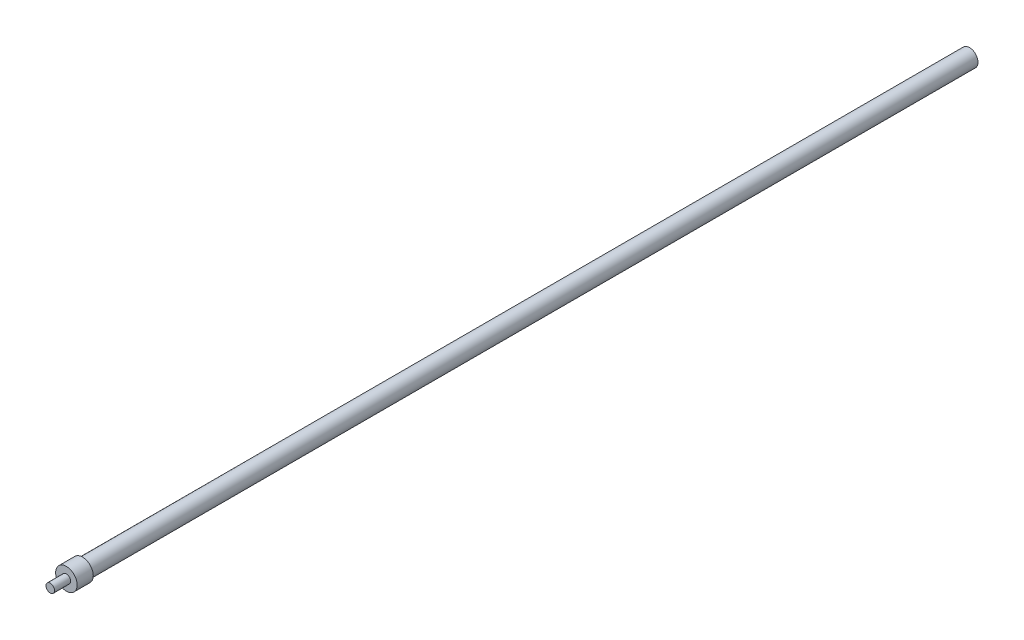
ISO-10303-21;
HEADER;
FILE_DESCRIPTION(('STEP AP214'),'2;1');
FILE_NAME('part.step','',(''),(''),'','','');
FILE_SCHEMA(('AUTOMOTIVE_DESIGN { 1 0 10303 214 1 1 1 1 }'));
ENDSEC;
DATA;
#1=APPLICATION_CONTEXT('core data for automotive mechanical design processes');
#2=APPLICATION_PROTOCOL_DEFINITION('international standard','automotive_design',2000,#1);
#3=PRODUCT_CONTEXT('',#1,'mechanical');
#4=PRODUCT('Part','Part','',(#3));
#5=PRODUCT_RELATED_PRODUCT_CATEGORY('part','',(#4));
#6=PRODUCT_DEFINITION_FORMATION('','',#4);
#7=PRODUCT_DEFINITION_CONTEXT('part definition',#1,'design');
#8=PRODUCT_DEFINITION('design','',#6,#7);
#9=PRODUCT_DEFINITION_SHAPE('','',#8);
#10=(LENGTH_UNIT() NAMED_UNIT(*) SI_UNIT(.MILLI.,.METRE.));
#11=(NAMED_UNIT(*) PLANE_ANGLE_UNIT() SI_UNIT($,.RADIAN.));
#12=(NAMED_UNIT(*) SI_UNIT($,.STERADIAN.) SOLID_ANGLE_UNIT());
#13=UNCERTAINTY_MEASURE_WITH_UNIT(LENGTH_MEASURE(1.E-05),#10,'distance_accuracy_value','');
#14=(GEOMETRIC_REPRESENTATION_CONTEXT(3) GLOBAL_UNCERTAINTY_ASSIGNED_CONTEXT((#13)) GLOBAL_UNIT_ASSIGNED_CONTEXT((#10,
#11,#12)) REPRESENTATION_CONTEXT('',''));
#15=CARTESIAN_POINT('',(0.,0.,0.));
#16=DIRECTION('',(0.,0.,1.));
#17=DIRECTION('',(1.,0.,0.));
#18=AXIS2_PLACEMENT_3D('',#15,#16,#17);
#19=CARTESIAN_POINT('',(0.,0.,660.));
#20=DIRECTION('',(0.,0.,-1.));
#21=DIRECTION('',(-1.,0.,0.));
#22=AXIS2_PLACEMENT_3D('',#19,#20,#21);
#23=CYLINDRICAL_SURFACE('',#22,6.35);
#24=CARTESIAN_POINT('',(0.,0.,660.));
#25=DIRECTION('',(0.,0.,1.));
#26=DIRECTION('',(1.,0.,0.));
#27=AXIS2_PLACEMENT_3D('',#24,#25,#26);
#28=CIRCLE('',#27,6.35);
#29=CARTESIAN_POINT('',(6.35,0.,660.));
#30=VERTEX_POINT('',#29);
#31=EDGE_CURVE('E10',#30,#30,#28,.T.);
#32=ORIENTED_EDGE('',*,*,#31,.F.);
#33=EDGE_LOOP('',(#32));
#34=FACE_BOUND('',#33,.T.);
#35=CARTESIAN_POINT('',(0.,0.,0.));
#36=DIRECTION('',(0.,0.,1.));
#37=DIRECTION('',(1.,0.,0.));
#38=AXIS2_PLACEMENT_3D('',#35,#36,#37);
#39=CIRCLE('',#38,6.35);
#40=CARTESIAN_POINT('',(6.35,0.,0.));
#41=VERTEX_POINT('',#40);
#42=EDGE_CURVE('E34',#41,#41,#39,.T.);
#43=ORIENTED_EDGE('',*,*,#42,.T.);
#44=EDGE_LOOP('',(#43));
#45=FACE_BOUND('',#44,.T.);
#46=ADVANCED_FACE('F31',(#34,#45),#23,.T.);
#47=CARTESIAN_POINT('',(0.,0.,0.));
#48=DIRECTION('',(0.,0.,1.));
#49=DIRECTION('',(1.,0.,0.));
#50=AXIS2_PLACEMENT_3D('',#47,#48,#49);
#51=PLANE('',#50);
#52=ORIENTED_EDGE('',*,*,#42,.F.);
#53=EDGE_LOOP('',(#52));
#54=FACE_BOUND('',#53,.T.);
#55=ADVANCED_FACE('F73',(#54),#51,.F.);
#56=CARTESIAN_POINT('',(0.,0.,672.));
#57=DIRECTION('',(0.,0.,-1.));
#58=DIRECTION('',(-1.,0.,0.));
#59=AXIS2_PLACEMENT_3D('',#56,#57,#58);
#60=CYLINDRICAL_SURFACE('',#59,8.);
#61=CARTESIAN_POINT('',(0.,0.,672.));
#62=DIRECTION('',(0.,0.,1.));
#63=DIRECTION('',(1.,0.,0.));
#64=AXIS2_PLACEMENT_3D('',#61,#62,#63);
#65=CIRCLE('',#64,8.);
#66=CARTESIAN_POINT('',(8.,0.,672.));
#67=VERTEX_POINT('',#66);
#68=EDGE_CURVE('E41',#67,#67,#65,.T.);
#69=ORIENTED_EDGE('',*,*,#68,.F.);
#70=EDGE_LOOP('',(#69));
#71=FACE_BOUND('',#70,.T.);
#72=CARTESIAN_POINT('',(0.,0.,660.));
#73=DIRECTION('',(0.,0.,1.));
#74=DIRECTION('',(1.,0.,0.));
#75=AXIS2_PLACEMENT_3D('',#72,#73,#74);
#76=CIRCLE('',#75,8.);
#77=CARTESIAN_POINT('',(8.,0.,660.));
#78=VERTEX_POINT('',#77);
#79=EDGE_CURVE('E43',#78,#78,#76,.T.);
#80=ORIENTED_EDGE('',*,*,#79,.T.);
#81=EDGE_LOOP('',(#80));
#82=FACE_BOUND('',#81,.T.);
#83=ADVANCED_FACE('F67',(#71,#82),#60,.T.);
#84=CARTESIAN_POINT('',(0.,0.,672.));
#85=DIRECTION('',(0.,0.,1.));
#86=DIRECTION('',(1.,0.,0.));
#87=AXIS2_PLACEMENT_3D('',#84,#85,#86);
#88=PLANE('',#87);
#89=CARTESIAN_POINT('',(0.,0.,672.));
#90=DIRECTION('',(0.,0.,1.));
#91=DIRECTION('',(1.,0.,0.));
#92=AXIS2_PLACEMENT_3D('',#89,#90,#91);
#93=CIRCLE('',#92,3.175);
#94=CARTESIAN_POINT('',(3.175,0.,672.));
#95=VERTEX_POINT('',#94);
#96=EDGE_CURVE('E49',#95,#95,#93,.T.);
#97=ORIENTED_EDGE('',*,*,#96,.F.);
#98=EDGE_LOOP('',(#97));
#99=FACE_BOUND('',#98,.T.);
#100=ORIENTED_EDGE('',*,*,#68,.T.);
#101=EDGE_LOOP('',(#100));
#102=FACE_BOUND('',#101,.T.);
#103=ADVANCED_FACE('F64',(#99,#102),#88,.T.);
#104=CARTESIAN_POINT('',(0.,0.,660.));
#105=DIRECTION('',(0.,0.,1.));
#106=DIRECTION('',(1.,0.,0.));
#107=AXIS2_PLACEMENT_3D('',#104,#105,#106);
#108=PLANE('',#107);
#109=ORIENTED_EDGE('',*,*,#31,.T.);
#110=EDGE_LOOP('',(#109));
#111=FACE_BOUND('',#110,.T.);
#112=ORIENTED_EDGE('',*,*,#79,.F.);
#113=EDGE_LOOP('',(#112));
#114=FACE_BOUND('',#113,.T.);
#115=ADVANCED_FACE('F60',(#111,#114),#108,.F.);
#116=CARTESIAN_POINT('',(0.,0.,684.));
#117=DIRECTION('',(0.,0.,-1.));
#118=DIRECTION('',(-1.,0.,0.));
#119=AXIS2_PLACEMENT_3D('',#116,#117,#118);
#120=CYLINDRICAL_SURFACE('',#119,3.175);
#121=CARTESIAN_POINT('',(0.,0.,684.));
#122=DIRECTION('',(0.,0.,1.));
#123=DIRECTION('',(1.,0.,0.));
#124=AXIS2_PLACEMENT_3D('',#121,#122,#123);
#125=CIRCLE('',#124,3.175);
#126=CARTESIAN_POINT('',(3.175,0.,684.));
#127=VERTEX_POINT('',#126);
#128=EDGE_CURVE('E46',#127,#127,#125,.T.);
#129=ORIENTED_EDGE('',*,*,#128,.F.);
#130=EDGE_LOOP('',(#129));
#131=FACE_BOUND('',#130,.T.);
#132=ORIENTED_EDGE('',*,*,#96,.T.);
#133=EDGE_LOOP('',(#132));
#134=FACE_BOUND('',#133,.T.);
#135=ADVANCED_FACE('F57',(#131,#134),#120,.T.);
#136=CARTESIAN_POINT('',(0.,0.,684.));
#137=DIRECTION('',(0.,0.,1.));
#138=DIRECTION('',(1.,0.,0.));
#139=AXIS2_PLACEMENT_3D('',#136,#137,#138);
#140=PLANE('',#139);
#141=ORIENTED_EDGE('',*,*,#128,.T.);
#142=EDGE_LOOP('',(#141));
#143=FACE_BOUND('',#142,.T.);
#144=ADVANCED_FACE('F55',(#143),#140,.T.);
#145=CLOSED_SHELL('',(#46,#55,#83,#103,#115,#135,#144));
#146=MANIFOLD_SOLID_BREP('B2',#145);
#147=ADVANCED_BREP_SHAPE_REPRESENTATION('',(#18,#146),#14);
#148=SHAPE_DEFINITION_REPRESENTATION(#9,#147);
ENDSEC;
END-ISO-10303-21;
